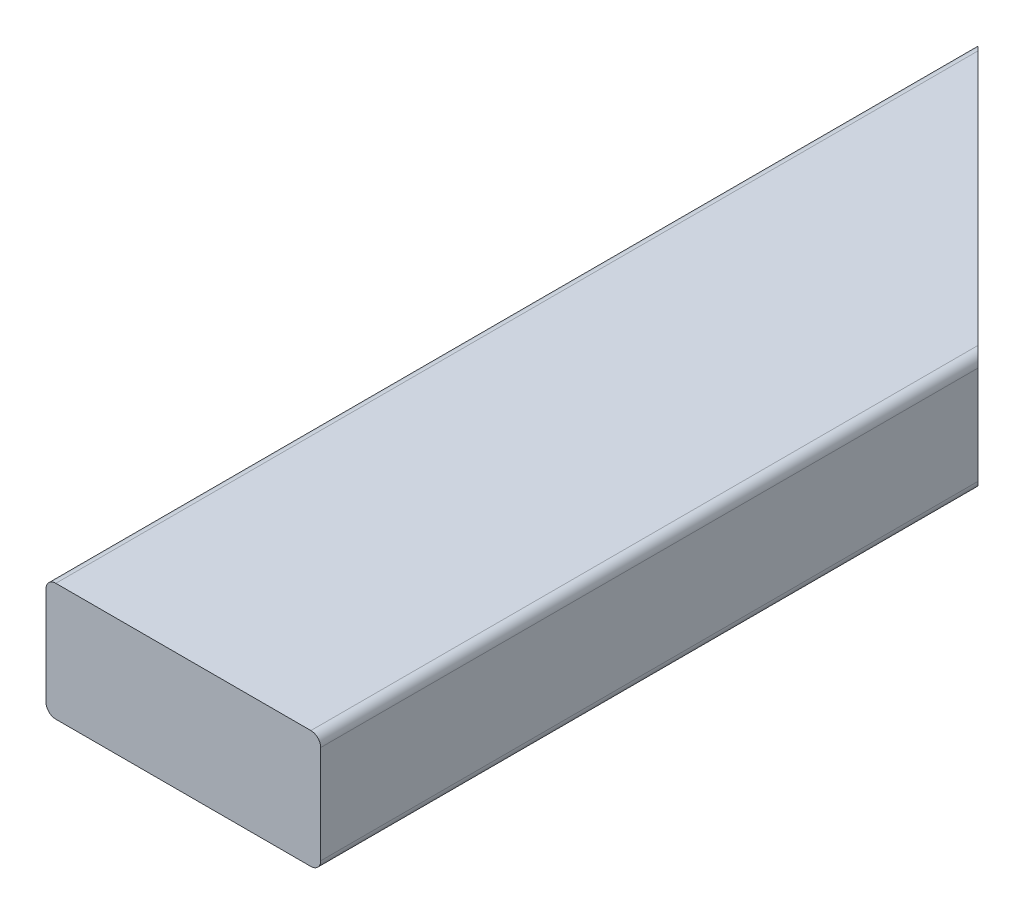
ISO-10303-21;
HEADER;
FILE_DESCRIPTION(('STEP AP214'),'2;1');
FILE_NAME('part.step','',(''),(''),'','','');
FILE_SCHEMA(('AUTOMOTIVE_DESIGN { 1 0 10303 214 1 1 1 1 }'));
ENDSEC;
DATA;
#1=APPLICATION_CONTEXT('core data for automotive mechanical design processes');
#2=APPLICATION_PROTOCOL_DEFINITION('international standard','automotive_design',2000,#1);
#3=PRODUCT_CONTEXT('',#1,'mechanical');
#4=PRODUCT('Part','Part','',(#3));
#5=PRODUCT_RELATED_PRODUCT_CATEGORY('part','',(#4));
#6=PRODUCT_DEFINITION_FORMATION('','',#4);
#7=PRODUCT_DEFINITION_CONTEXT('part definition',#1,'design');
#8=PRODUCT_DEFINITION('design','',#6,#7);
#9=PRODUCT_DEFINITION_SHAPE('','',#8);
#10=(LENGTH_UNIT() NAMED_UNIT(*) SI_UNIT(.MILLI.,.METRE.));
#11=(NAMED_UNIT(*) PLANE_ANGLE_UNIT() SI_UNIT($,.RADIAN.));
#12=(NAMED_UNIT(*) SI_UNIT($,.STERADIAN.) SOLID_ANGLE_UNIT());
#13=UNCERTAINTY_MEASURE_WITH_UNIT(LENGTH_MEASURE(1.E-05),#10,'distance_accuracy_value','');
#14=(GEOMETRIC_REPRESENTATION_CONTEXT(3) GLOBAL_UNCERTAINTY_ASSIGNED_CONTEXT((#13)) GLOBAL_UNIT_ASSIGNED_CONTEXT((#10,
#11,#12)) REPRESENTATION_CONTEXT('',''));
#15=CARTESIAN_POINT('',(0.,0.,0.));
#16=DIRECTION('',(0.,0.,1.));
#17=DIRECTION('',(1.,0.,0.));
#18=AXIS2_PLACEMENT_3D('',#15,#16,#17);
#19=CARTESIAN_POINT('',(0.,38.1,212.725));
#20=DIRECTION('',(-1.,0.,0.));
#21=DIRECTION('',(0.,0.,1.));
#22=AXIS2_PLACEMENT_3D('',#19,#20,#21);
#23=PLANE('',#22);
#24=DIRECTION('',(0.,-1.,0.));
#25=VECTOR('',#24,1.);
#26=CARTESIAN_POINT('',(0.,38.1,212.725));
#27=LINE('',#26,#25);
#28=CARTESIAN_POINT('',(0.,34.925,212.725));
#29=VERTEX_POINT('',#28);
#30=CARTESIAN_POINT('',(0.,3.17500000000001,212.725));
#31=VERTEX_POINT('',#30);
#32=EDGE_CURVE('E120',#29,#31,#27,.T.);
#33=ORIENTED_EDGE('',*,*,#32,.T.);
#34=DIRECTION('',(0.,0.,-1.));
#35=VECTOR('',#34,1.);
#36=CARTESIAN_POINT('',(0.,3.175,0.));
#37=LINE('',#36,#35);
#38=CARTESIAN_POINT('',(0.,3.17500000000001,0.));
#39=VERTEX_POINT('',#38);
#40=EDGE_CURVE('E11',#31,#39,#37,.T.);
#41=ORIENTED_EDGE('',*,*,#40,.T.);
#42=DIRECTION('',(0.,-1.,0.));
#43=VECTOR('',#42,1.);
#44=CARTESIAN_POINT('',(0.,38.1,0.));
#45=LINE('',#44,#43);
#46=CARTESIAN_POINT('',(0.,34.925,0.));
#47=VERTEX_POINT('',#46);
#48=EDGE_CURVE('E125',#47,#39,#45,.T.);
#49=ORIENTED_EDGE('',*,*,#48,.F.);
#50=DIRECTION('',(0.,0.,-1.));
#51=VECTOR('',#50,1.);
#52=CARTESIAN_POINT('',(0.,34.925,212.725));
#53=LINE('',#52,#51);
#54=EDGE_CURVE('E40',#47,#29,#53,.F.);
#55=ORIENTED_EDGE('',*,*,#54,.T.);
#56=EDGE_LOOP('',(#33,#41,#49,#55));
#57=FACE_BOUND('',#56,.T.);
#58=ADVANCED_FACE('F32',(#57),#23,.F.);
#59=CARTESIAN_POINT('',(0.,38.1,0.));
#60=DIRECTION('',(-0.707106781186543,0.,0.707106781186551));
#61=DIRECTION('',(0.707106781186552,0.,0.707106781186544));
#62=AXIS2_PLACEMENT_3D('',#59,#60,#61);
#63=PLANE('',#62);
#64=DIRECTION('',(-0.707106781186551,0.,-0.707106781186543));
#65=VECTOR('',#64,1.);
#66=CARTESIAN_POINT('',(0.,0.,0.));
#67=LINE('',#66,#65);
#68=CARTESIAN_POINT('',(-3.175,0.,-3.17499999999996));
#69=VERTEX_POINT('',#68);
#70=CARTESIAN_POINT('',(-85.725,0.,-85.7249999999991));
#71=VERTEX_POINT('',#70);
#72=EDGE_CURVE('E167',#69,#71,#67,.T.);
#73=ORIENTED_EDGE('',*,*,#72,.T.);
#74=CARTESIAN_POINT('',(-85.725,3.175,-85.7249999999991));
#75=DIRECTION('',(-0.707106781186543,0.,0.707106781186551));
#76=DIRECTION('',(-0.707106781186552,0.,-0.707106781186544));
#77=AXIS2_PLACEMENT_3D('',#74,#75,#76);
#78=ELLIPSE('',#77,4.49012806053455,3.175);
#79=CARTESIAN_POINT('',(-88.9,3.17500000000001,-88.899999999999));
#80=VERTEX_POINT('',#79);
#81=EDGE_CURVE('E142',#71,#80,#78,.F.);
#82=ORIENTED_EDGE('',*,*,#81,.T.);
#83=DIRECTION('',(0.,-1.,0.));
#84=VECTOR('',#83,1.);
#85=CARTESIAN_POINT('',(-88.9,38.1,-88.899999999999));
#86=LINE('',#85,#84);
#87=CARTESIAN_POINT('',(-88.9,34.925,-88.899999999999));
#88=VERTEX_POINT('',#87);
#89=EDGE_CURVE('E119',#88,#80,#86,.T.);
#90=ORIENTED_EDGE('',*,*,#89,.F.);
#91=CARTESIAN_POINT('',(-85.725,34.925,-85.7249999999991));
#92=DIRECTION('',(-0.707106781186543,0.,0.707106781186551));
#93=DIRECTION('',(0.707106781186552,0.,0.707106781186544));
#94=AXIS2_PLACEMENT_3D('',#91,#92,#93);
#95=ELLIPSE('',#94,4.49012806053455,3.175);
#96=CARTESIAN_POINT('',(-85.725,38.1,-85.7249999999991));
#97=VERTEX_POINT('',#96);
#98=EDGE_CURVE('E124',#88,#97,#95,.F.);
#99=ORIENTED_EDGE('',*,*,#98,.T.);
#100=DIRECTION('',(-0.707106781186551,0.,-0.707106781186543));
#101=VECTOR('',#100,1.);
#102=CARTESIAN_POINT('',(0.,38.1,0.));
#103=LINE('',#102,#101);
#104=CARTESIAN_POINT('',(-3.175,38.1,-3.17499999999996));
#105=VERTEX_POINT('',#104);
#106=EDGE_CURVE('E161',#105,#97,#103,.T.);
#107=ORIENTED_EDGE('',*,*,#106,.F.);
#108=CARTESIAN_POINT('',(-3.175,34.925,-3.17499999999996));
#109=DIRECTION('',(-0.707106781186543,0.,0.707106781186551));
#110=DIRECTION('',(-0.707106781186552,0.,-0.707106781186544));
#111=AXIS2_PLACEMENT_3D('',#108,#109,#110);
#112=ELLIPSE('',#111,4.49012806053455,3.175);
#113=EDGE_CURVE('E54',#105,#47,#112,.F.);
#114=ORIENTED_EDGE('',*,*,#113,.T.);
#115=ORIENTED_EDGE('',*,*,#48,.T.);
#116=CARTESIAN_POINT('',(-3.175,3.175,-3.17499999999998));
#117=DIRECTION('',(-0.707106781186543,0.,0.707106781186551));
#118=DIRECTION('',(0.707106781186552,0.,0.707106781186544));
#119=AXIS2_PLACEMENT_3D('',#116,#117,#118);
#120=ELLIPSE('',#119,4.49012806053455,3.175);
#121=EDGE_CURVE('E47',#39,#69,#120,.F.);
#122=ORIENTED_EDGE('',*,*,#121,.T.);
#123=EDGE_LOOP('',(#73,#82,#90,#99,#107,#114,#115,#122));
#124=FACE_BOUND('',#123,.T.);
#125=ADVANCED_FACE('F163',(#124),#63,.F.);
#126=CARTESIAN_POINT('',(-88.9,38.1,-88.899999999999));
#127=DIRECTION('',(1.,0.,0.));
#128=DIRECTION('',(0.,0.,-1.));
#129=AXIS2_PLACEMENT_3D('',#126,#127,#128);
#130=PLANE('',#129);
#131=ORIENTED_EDGE('',*,*,#89,.T.);
#132=DIRECTION('',(0.,0.,1.));
#133=VECTOR('',#132,1.);
#134=CARTESIAN_POINT('',(-88.9,3.175,212.725));
#135=LINE('',#134,#133);
#136=CARTESIAN_POINT('',(-88.9,3.17500000000001,212.725));
#137=VERTEX_POINT('',#136);
#138=EDGE_CURVE('E118',#80,#137,#135,.T.);
#139=ORIENTED_EDGE('',*,*,#138,.T.);
#140=DIRECTION('',(0.,-1.,0.));
#141=VECTOR('',#140,1.);
#142=CARTESIAN_POINT('',(-88.9,38.1,212.725));
#143=LINE('',#142,#141);
#144=CARTESIAN_POINT('',(-88.9,34.925,212.725));
#145=VERTEX_POINT('',#144);
#146=EDGE_CURVE('E101',#145,#137,#143,.T.);
#147=ORIENTED_EDGE('',*,*,#146,.F.);
#148=DIRECTION('',(0.,0.,1.));
#149=VECTOR('',#148,1.);
#150=CARTESIAN_POINT('',(-88.9,34.925,-88.899999999999));
#151=LINE('',#150,#149);
#152=EDGE_CURVE('E115',#145,#88,#151,.F.);
#153=ORIENTED_EDGE('',*,*,#152,.T.);
#154=EDGE_LOOP('',(#131,#139,#147,#153));
#155=FACE_BOUND('',#154,.T.);
#156=ADVANCED_FACE('F114',(#155),#130,.F.);
#157=CARTESIAN_POINT('',(-88.9,38.1,212.725));
#158=DIRECTION('',(0.,0.,-1.));
#159=DIRECTION('',(-1.,0.,0.));
#160=AXIS2_PLACEMENT_3D('',#157,#158,#159);
#161=PLANE('',#160);
#162=ORIENTED_EDGE('',*,*,#146,.T.);
#163=CARTESIAN_POINT('',(-85.725,3.175,212.725));
#164=DIRECTION('',(0.,0.,-1.));
#165=DIRECTION('',(-1.,0.,0.));
#166=AXIS2_PLACEMENT_3D('',#163,#164,#165);
#167=CIRCLE('',#166,3.175);
#168=CARTESIAN_POINT('',(-85.725,0.,212.725));
#169=VERTEX_POINT('',#168);
#170=EDGE_CURVE('E108',#137,#169,#167,.F.);
#171=ORIENTED_EDGE('',*,*,#170,.T.);
#172=DIRECTION('',(1.,0.,0.));
#173=VECTOR('',#172,1.);
#174=CARTESIAN_POINT('',(-88.9,0.,212.725));
#175=LINE('',#174,#173);
#176=CARTESIAN_POINT('',(-3.175,0.,212.725));
#177=VERTEX_POINT('',#176);
#178=EDGE_CURVE('E164',#169,#177,#175,.T.);
#179=ORIENTED_EDGE('',*,*,#178,.T.);
#180=CARTESIAN_POINT('',(-3.175,3.175,212.725));
#181=DIRECTION('',(0.,0.,-1.));
#182=DIRECTION('',(-1.,0.,0.));
#183=AXIS2_PLACEMENT_3D('',#180,#181,#182);
#184=CIRCLE('',#183,3.175);
#185=EDGE_CURVE('E109',#177,#31,#184,.F.);
#186=ORIENTED_EDGE('',*,*,#185,.T.);
#187=ORIENTED_EDGE('',*,*,#32,.F.);
#188=CARTESIAN_POINT('',(-3.175,34.925,212.725));
#189=DIRECTION('',(0.,0.,-1.));
#190=DIRECTION('',(-1.,0.,0.));
#191=AXIS2_PLACEMENT_3D('',#188,#189,#190);
#192=CIRCLE('',#191,3.175);
#193=CARTESIAN_POINT('',(-3.175,38.1,212.725));
#194=VERTEX_POINT('',#193);
#195=EDGE_CURVE('E127',#29,#194,#192,.F.);
#196=ORIENTED_EDGE('',*,*,#195,.T.);
#197=DIRECTION('',(1.,0.,0.));
#198=VECTOR('',#197,1.);
#199=CARTESIAN_POINT('',(-88.9,38.1,212.725));
#200=LINE('',#199,#198);
#201=CARTESIAN_POINT('',(-85.725,38.1,212.725));
#202=VERTEX_POINT('',#201);
#203=EDGE_CURVE('E103',#202,#194,#200,.T.);
#204=ORIENTED_EDGE('',*,*,#203,.F.);
#205=CARTESIAN_POINT('',(-85.725,34.925,212.725));
#206=DIRECTION('',(0.,0.,-1.));
#207=DIRECTION('',(-1.,0.,0.));
#208=AXIS2_PLACEMENT_3D('',#205,#206,#207);
#209=CIRCLE('',#208,3.175);
#210=EDGE_CURVE('E98',#202,#145,#209,.F.);
#211=ORIENTED_EDGE('',*,*,#210,.T.);
#212=EDGE_LOOP('',(#162,#171,#179,#186,#187,#196,#204,#211));
#213=FACE_BOUND('',#212,.T.);
#214=ADVANCED_FACE('F100',(#213),#161,.F.);
#215=CARTESIAN_POINT('',(0.,38.1,0.));
#216=DIRECTION('',(0.,-1.,0.));
#217=DIRECTION('',(0.,0.,-1.));
#218=AXIS2_PLACEMENT_3D('',#215,#216,#217);
#219=PLANE('',#218);
#220=ORIENTED_EDGE('',*,*,#106,.T.);
#221=DIRECTION('',(0.,0.,1.));
#222=VECTOR('',#221,1.);
#223=CARTESIAN_POINT('',(-85.725,38.1,0.));
#224=LINE('',#223,#222);
#225=EDGE_CURVE('E147',#97,#202,#224,.T.);
#226=ORIENTED_EDGE('',*,*,#225,.T.);
#227=ORIENTED_EDGE('',*,*,#203,.T.);
#228=DIRECTION('',(0.,0.,-1.));
#229=VECTOR('',#228,1.);
#230=CARTESIAN_POINT('',(-3.175,38.1,0.));
#231=LINE('',#230,#229);
#232=EDGE_CURVE('E144',#194,#105,#231,.T.);
#233=ORIENTED_EDGE('',*,*,#232,.T.);
#234=EDGE_LOOP('',(#220,#226,#227,#233));
#235=FACE_BOUND('',#234,.T.);
#236=ADVANCED_FACE('F160',(#235),#219,.F.);
#237=CARTESIAN_POINT('',(0.,0.,0.));
#238=DIRECTION('',(0.,-1.,0.));
#239=DIRECTION('',(0.,0.,-1.));
#240=AXIS2_PLACEMENT_3D('',#237,#238,#239);
#241=PLANE('',#240);
#242=ORIENTED_EDGE('',*,*,#178,.F.);
#243=DIRECTION('',(0.,0.,1.));
#244=VECTOR('',#243,1.);
#245=CARTESIAN_POINT('',(-85.725,0.,-88.899999999999));
#246=LINE('',#245,#244);
#247=EDGE_CURVE('E137',#169,#71,#246,.F.);
#248=ORIENTED_EDGE('',*,*,#247,.T.);
#249=ORIENTED_EDGE('',*,*,#72,.F.);
#250=DIRECTION('',(0.,0.,-1.));
#251=VECTOR('',#250,1.);
#252=CARTESIAN_POINT('',(-3.175,0.,212.725));
#253=LINE('',#252,#251);
#254=EDGE_CURVE('E135',#69,#177,#253,.F.);
#255=ORIENTED_EDGE('',*,*,#254,.T.);
#256=EDGE_LOOP('',(#242,#248,#249,#255));
#257=FACE_BOUND('',#256,.T.);
#258=ADVANCED_FACE('F176',(#257),#241,.T.);
#259=CARTESIAN_POINT('',(-85.725,3.175,-88.899999999999));
#260=DIRECTION('',(0.,0.,-1.));
#261=DIRECTION('',(-1.,0.,0.));
#262=AXIS2_PLACEMENT_3D('',#259,#260,#261);
#263=CYLINDRICAL_SURFACE('',#262,3.175);
#264=ORIENTED_EDGE('',*,*,#81,.F.);
#265=ORIENTED_EDGE('',*,*,#247,.F.);
#266=ORIENTED_EDGE('',*,*,#170,.F.);
#267=ORIENTED_EDGE('',*,*,#138,.F.);
#268=EDGE_LOOP('',(#264,#265,#266,#267));
#269=FACE_BOUND('',#268,.T.);
#270=ADVANCED_FACE('F172',(#269),#263,.T.);
#271=CARTESIAN_POINT('',(-85.725,34.925,0.));
#272=DIRECTION('',(0.,0.,1.));
#273=DIRECTION('',(1.,0.,0.));
#274=AXIS2_PLACEMENT_3D('',#271,#272,#273);
#275=CYLINDRICAL_SURFACE('',#274,3.175);
#276=ORIENTED_EDGE('',*,*,#98,.F.);
#277=ORIENTED_EDGE('',*,*,#152,.F.);
#278=ORIENTED_EDGE('',*,*,#210,.F.);
#279=ORIENTED_EDGE('',*,*,#225,.F.);
#280=EDGE_LOOP('',(#276,#277,#278,#279));
#281=FACE_BOUND('',#280,.T.);
#282=ADVANCED_FACE('F123',(#281),#275,.T.);
#283=CARTESIAN_POINT('',(-3.175,3.175,212.725));
#284=DIRECTION('',(0.,0.,1.));
#285=DIRECTION('',(1.,0.,0.));
#286=AXIS2_PLACEMENT_3D('',#283,#284,#285);
#287=CYLINDRICAL_SURFACE('',#286,3.175);
#288=ORIENTED_EDGE('',*,*,#185,.F.);
#289=ORIENTED_EDGE('',*,*,#254,.F.);
#290=ORIENTED_EDGE('',*,*,#121,.F.);
#291=ORIENTED_EDGE('',*,*,#40,.F.);
#292=EDGE_LOOP('',(#288,#289,#290,#291));
#293=FACE_BOUND('',#292,.T.);
#294=ADVANCED_FACE('F178',(#293),#287,.T.);
#295=CARTESIAN_POINT('',(-3.175,34.925,0.));
#296=DIRECTION('',(0.,0.,-1.));
#297=DIRECTION('',(-1.,0.,0.));
#298=AXIS2_PLACEMENT_3D('',#295,#296,#297);
#299=CYLINDRICAL_SURFACE('',#298,3.175);
#300=ORIENTED_EDGE('',*,*,#195,.F.);
#301=ORIENTED_EDGE('',*,*,#54,.F.);
#302=ORIENTED_EDGE('',*,*,#113,.F.);
#303=ORIENTED_EDGE('',*,*,#232,.F.);
#304=EDGE_LOOP('',(#300,#301,#302,#303));
#305=FACE_BOUND('',#304,.T.);
#306=ADVANCED_FACE('F34',(#305),#299,.T.);
#307=CLOSED_SHELL('',(#58,#125,#156,#214,#236,#258,#270,#282,#294,#306));
#308=MANIFOLD_SOLID_BREP('B2',#307);
#309=ADVANCED_BREP_SHAPE_REPRESENTATION('',(#18,#308),#14);
#310=SHAPE_DEFINITION_REPRESENTATION(#9,#309);
ENDSEC;
END-ISO-10303-21;
